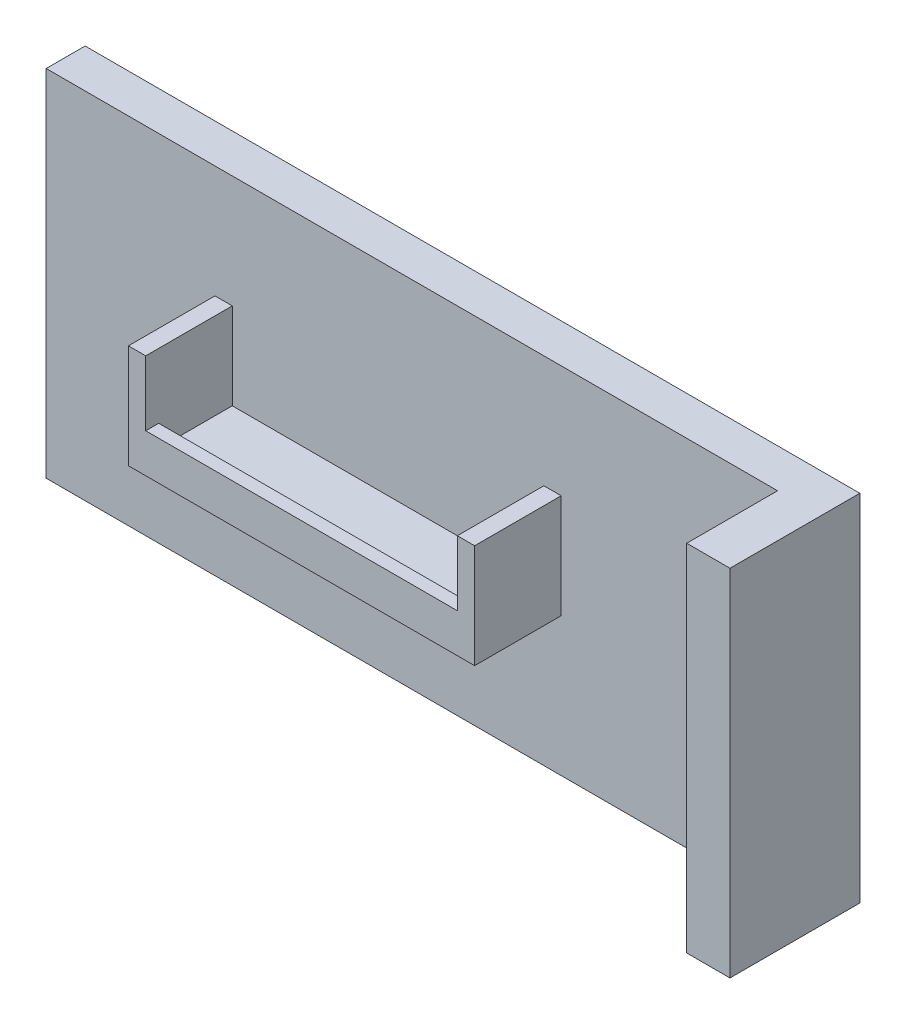
ISO-10303-21;
HEADER;
FILE_DESCRIPTION(('STEP AP214'),'2;1');
FILE_NAME('part.step','',(''),(''),'','','');
FILE_SCHEMA(('AUTOMOTIVE_DESIGN { 1 0 10303 214 1 1 1 1 }'));
ENDSEC;
DATA;
#1=APPLICATION_CONTEXT('core data for automotive mechanical design processes');
#2=APPLICATION_PROTOCOL_DEFINITION('international standard','automotive_design',2000,#1);
#3=PRODUCT_CONTEXT('',#1,'mechanical');
#4=PRODUCT('Part','Part','',(#3));
#5=PRODUCT_RELATED_PRODUCT_CATEGORY('part','',(#4));
#6=PRODUCT_DEFINITION_FORMATION('','',#4);
#7=PRODUCT_DEFINITION_CONTEXT('part definition',#1,'design');
#8=PRODUCT_DEFINITION('design','',#6,#7);
#9=PRODUCT_DEFINITION_SHAPE('','',#8);
#10=(LENGTH_UNIT() NAMED_UNIT(*) SI_UNIT(.MILLI.,.METRE.));
#11=(NAMED_UNIT(*) PLANE_ANGLE_UNIT() SI_UNIT($,.RADIAN.));
#12=(NAMED_UNIT(*) SI_UNIT($,.STERADIAN.) SOLID_ANGLE_UNIT());
#13=UNCERTAINTY_MEASURE_WITH_UNIT(LENGTH_MEASURE(1.E-05),#10,'distance_accuracy_value','');
#14=(GEOMETRIC_REPRESENTATION_CONTEXT(3) GLOBAL_UNCERTAINTY_ASSIGNED_CONTEXT((#13)) GLOBAL_UNIT_ASSIGNED_CONTEXT((#10,
#11,#12)) REPRESENTATION_CONTEXT('',''));
#15=CARTESIAN_POINT('',(0.,0.,0.));
#16=DIRECTION('',(0.,0.,1.));
#17=DIRECTION('',(1.,0.,0.));
#18=AXIS2_PLACEMENT_3D('',#15,#16,#17);
#19=CARTESIAN_POINT('',(-130.,36.,29.));
#20=DIRECTION('',(0.,-1.,0.));
#21=DIRECTION('',(1.,0.,0.));
#22=AXIS2_PLACEMENT_3D('',#19,#20,#21);
#23=PLANE('',#22);
#24=DIRECTION('',(-1.,0.,0.));
#25=VECTOR('',#24,1.);
#26=CARTESIAN_POINT('',(-126.,36.,26.));
#27=LINE('',#26,#25);
#28=CARTESIAN_POINT('',(-54.,36.,26.));
#29=VERTEX_POINT('',#28);
#30=CARTESIAN_POINT('',(-126.,36.,26.));
#31=VERTEX_POINT('',#30);
#32=EDGE_CURVE('E177',#29,#31,#27,.T.);
#33=ORIENTED_EDGE('',*,*,#32,.F.);
#34=DIRECTION('',(0.,0.,1.));
#35=VECTOR('',#34,1.);
#36=CARTESIAN_POINT('',(-54.,36.,9.));
#37=LINE('',#36,#35);
#38=CARTESIAN_POINT('',(-54.,36.,9.));
#39=VERTEX_POINT('',#38);
#40=EDGE_CURVE('E162',#39,#29,#37,.T.);
#41=ORIENTED_EDGE('',*,*,#40,.F.);
#42=DIRECTION('',(-1.,0.,0.));
#43=VECTOR('',#42,1.);
#44=CARTESIAN_POINT('',(-130.,36.,9.));
#45=LINE('',#44,#43);
#46=CARTESIAN_POINT('',(-126.,36.,9.));
#47=VERTEX_POINT('',#46);
#48=EDGE_CURVE('E218',#39,#47,#45,.T.);
#49=ORIENTED_EDGE('',*,*,#48,.T.);
#50=DIRECTION('',(0.,0.,-1.));
#51=VECTOR('',#50,1.);
#52=CARTESIAN_POINT('',(-126.,36.,9.));
#53=LINE('',#52,#51);
#54=EDGE_CURVE('E187',#31,#47,#53,.T.);
#55=ORIENTED_EDGE('',*,*,#54,.F.);
#56=EDGE_LOOP('',(#33,#41,#49,#55));
#57=FACE_BOUND('',#56,.T.);
#58=ADVANCED_FACE('F39',(#57),#23,.F.);
#59=CARTESIAN_POINT('',(-54.,56.,9.));
#60=DIRECTION('',(1.,0.,0.));
#61=DIRECTION('',(0.,1.,0.));
#62=AXIS2_PLACEMENT_3D('',#59,#60,#61);
#63=PLANE('',#62);
#64=DIRECTION('',(0.,-1.,0.));
#65=VECTOR('',#64,1.);
#66=CARTESIAN_POINT('',(-54.,41.,26.));
#67=LINE('',#66,#65);
#68=CARTESIAN_POINT('',(-54.,41.,26.));
#69=VERTEX_POINT('',#68);
#70=EDGE_CURVE('E54',#69,#29,#67,.T.);
#71=ORIENTED_EDGE('',*,*,#70,.F.);
#72=DIRECTION('',(0.,0.,-1.));
#73=VECTOR('',#72,1.);
#74=CARTESIAN_POINT('',(-54.,41.,29.));
#75=LINE('',#74,#73);
#76=CARTESIAN_POINT('',(-54.,41.,29.));
#77=VERTEX_POINT('',#76);
#78=EDGE_CURVE('E58',#77,#69,#75,.T.);
#79=ORIENTED_EDGE('',*,*,#78,.F.);
#80=DIRECTION('',(0.,-1.,0.));
#81=VECTOR('',#80,1.);
#82=CARTESIAN_POINT('',(-54.,56.,29.));
#83=LINE('',#82,#81);
#84=CARTESIAN_POINT('',(-54.,56.,29.));
#85=VERTEX_POINT('',#84);
#86=EDGE_CURVE('E170',#85,#77,#83,.T.);
#87=ORIENTED_EDGE('',*,*,#86,.F.);
#88=DIRECTION('',(0.,0.,1.));
#89=VECTOR('',#88,1.);
#90=CARTESIAN_POINT('',(-54.,56.,9.));
#91=LINE('',#90,#89);
#92=CARTESIAN_POINT('',(-54.,56.,9.));
#93=VERTEX_POINT('',#92);
#94=EDGE_CURVE('E205',#93,#85,#91,.T.);
#95=ORIENTED_EDGE('',*,*,#94,.F.);
#96=DIRECTION('',(0.,-1.,0.));
#97=VECTOR('',#96,1.);
#98=CARTESIAN_POINT('',(-54.,56.,9.));
#99=LINE('',#98,#97);
#100=EDGE_CURVE('E212',#93,#39,#99,.T.);
#101=ORIENTED_EDGE('',*,*,#100,.T.);
#102=ORIENTED_EDGE('',*,*,#40,.T.);
#103=EDGE_LOOP('',(#71,#79,#87,#95,#101,#102));
#104=FACE_BOUND('',#103,.T.);
#105=ADVANCED_FACE('F313',(#104),#63,.F.);
#106=CARTESIAN_POINT('',(-126.,56.,9.));
#107=DIRECTION('',(-1.,0.,0.));
#108=DIRECTION('',(0.,-1.,0.));
#109=AXIS2_PLACEMENT_3D('',#106,#107,#108);
#110=PLANE('',#109);
#111=DIRECTION('',(0.,-1.,0.));
#112=VECTOR('',#111,1.);
#113=CARTESIAN_POINT('',(-126.,41.,26.));
#114=LINE('',#113,#112);
#115=CARTESIAN_POINT('',(-126.,41.,26.));
#116=VERTEX_POINT('',#115);
#117=EDGE_CURVE('E183',#116,#31,#114,.T.);
#118=ORIENTED_EDGE('',*,*,#117,.T.);
#119=ORIENTED_EDGE('',*,*,#54,.T.);
#120=DIRECTION('',(0.,-1.,0.));
#121=VECTOR('',#120,1.);
#122=CARTESIAN_POINT('',(-126.,56.,9.));
#123=LINE('',#122,#121);
#124=CARTESIAN_POINT('',(-126.,56.,9.));
#125=VERTEX_POINT('',#124);
#126=EDGE_CURVE('E163',#125,#47,#123,.T.);
#127=ORIENTED_EDGE('',*,*,#126,.F.);
#128=DIRECTION('',(0.,0.,-1.));
#129=VECTOR('',#128,1.);
#130=CARTESIAN_POINT('',(-126.,56.,9.));
#131=LINE('',#130,#129);
#132=CARTESIAN_POINT('',(-126.,56.,29.));
#133=VERTEX_POINT('',#132);
#134=EDGE_CURVE('E159',#133,#125,#131,.T.);
#135=ORIENTED_EDGE('',*,*,#134,.F.);
#136=DIRECTION('',(0.,-1.,0.));
#137=VECTOR('',#136,1.);
#138=CARTESIAN_POINT('',(-126.,56.,29.));
#139=LINE('',#138,#137);
#140=CARTESIAN_POINT('',(-126.,41.,29.));
#141=VERTEX_POINT('',#140);
#142=EDGE_CURVE('E152',#133,#141,#139,.T.);
#143=ORIENTED_EDGE('',*,*,#142,.T.);
#144=DIRECTION('',(0.,0.,1.));
#145=VECTOR('',#144,1.);
#146=CARTESIAN_POINT('',(-126.,41.,29.));
#147=LINE('',#146,#145);
#148=EDGE_CURVE('E156',#116,#141,#147,.T.);
#149=ORIENTED_EDGE('',*,*,#148,.F.);
#150=EDGE_LOOP('',(#118,#119,#127,#135,#143,#149));
#151=FACE_BOUND('',#150,.T.);
#152=ADVANCED_FACE('F154',(#151),#110,.F.);
#153=CARTESIAN_POINT('',(0.,0.,9.));
#154=DIRECTION('',(0.,0.,1.));
#155=DIRECTION('',(1.,0.,0.));
#156=AXIS2_PLACEMENT_3D('',#153,#154,#155);
#157=PLANE('',#156);
#158=DIRECTION('',(0.,1.,0.));
#159=VECTOR('',#158,1.);
#160=CARTESIAN_POINT('',(0.,0.,9.));
#161=LINE('',#160,#159);
#162=CARTESIAN_POINT('',(0.,0.,9.));
#163=VERTEX_POINT('',#162);
#164=CARTESIAN_POINT('',(0.,82.,9.));
#165=VERTEX_POINT('',#164);
#166=EDGE_CURVE('E259',#163,#165,#161,.T.);
#167=ORIENTED_EDGE('',*,*,#166,.T.);
#168=DIRECTION('',(-1.,0.,0.));
#169=VECTOR('',#168,1.);
#170=CARTESIAN_POINT('',(0.,82.,9.));
#171=LINE('',#170,#169);
#172=CARTESIAN_POINT('',(-169.,82.,9.));
#173=VERTEX_POINT('',#172);
#174=EDGE_CURVE('E262',#165,#173,#171,.T.);
#175=ORIENTED_EDGE('',*,*,#174,.T.);
#176=DIRECTION('',(0.,-1.,0.));
#177=VECTOR('',#176,1.);
#178=CARTESIAN_POINT('',(-169.,0.,9.));
#179=LINE('',#178,#177);
#180=CARTESIAN_POINT('',(-169.,0.,9.));
#181=VERTEX_POINT('',#180);
#182=EDGE_CURVE('E265',#173,#181,#179,.T.);
#183=ORIENTED_EDGE('',*,*,#182,.T.);
#184=DIRECTION('',(1.,0.,0.));
#185=VECTOR('',#184,1.);
#186=CARTESIAN_POINT('',(0.,0.,9.));
#187=LINE('',#186,#185);
#188=EDGE_CURVE('E267',#181,#163,#187,.T.);
#189=ORIENTED_EDGE('',*,*,#188,.T.);
#190=EDGE_LOOP('',(#167,#175,#183,#189));
#191=FACE_BOUND('',#190,.T.);
#192=DIRECTION('',(0.,-1.,0.));
#193=VECTOR('',#192,1.);
#194=CARTESIAN_POINT('',(-130.,36.,9.));
#195=LINE('',#194,#193);
#196=CARTESIAN_POINT('',(-130.,56.,9.));
#197=VERTEX_POINT('',#196);
#198=CARTESIAN_POINT('',(-130.,32.,9.));
#199=VERTEX_POINT('',#198);
#200=EDGE_CURVE('E214',#197,#199,#195,.T.);
#201=ORIENTED_EDGE('',*,*,#200,.F.);
#202=DIRECTION('',(-1.,0.,0.));
#203=VECTOR('',#202,1.);
#204=CARTESIAN_POINT('',(-130.,56.,9.));
#205=LINE('',#204,#203);
#206=EDGE_CURVE('E194',#125,#197,#205,.T.);
#207=ORIENTED_EDGE('',*,*,#206,.F.);
#208=ORIENTED_EDGE('',*,*,#126,.T.);
#209=ORIENTED_EDGE('',*,*,#48,.F.);
#210=ORIENTED_EDGE('',*,*,#100,.F.);
#211=DIRECTION('',(-1.,0.,0.));
#212=VECTOR('',#211,1.);
#213=CARTESIAN_POINT('',(-50.,56.,9.));
#214=LINE('',#213,#212);
#215=CARTESIAN_POINT('',(-50.,56.,9.));
#216=VERTEX_POINT('',#215);
#217=EDGE_CURVE('E203',#216,#93,#214,.T.);
#218=ORIENTED_EDGE('',*,*,#217,.F.);
#219=DIRECTION('',(0.,1.,0.));
#220=VECTOR('',#219,1.);
#221=CARTESIAN_POINT('',(-50.,36.,9.));
#222=LINE('',#221,#220);
#223=CARTESIAN_POINT('',(-50.,32.,9.));
#224=VERTEX_POINT('',#223);
#225=EDGE_CURVE('E227',#224,#216,#222,.T.);
#226=ORIENTED_EDGE('',*,*,#225,.F.);
#227=DIRECTION('',(1.,0.,0.));
#228=VECTOR('',#227,1.);
#229=CARTESIAN_POINT('',(-130.,32.,9.));
#230=LINE('',#229,#228);
#231=EDGE_CURVE('E225',#199,#224,#230,.T.);
#232=ORIENTED_EDGE('',*,*,#231,.F.);
#233=EDGE_LOOP('',(#201,#207,#208,#209,#210,#218,#226,#232));
#234=FACE_BOUND('',#233,.T.);
#235=ADVANCED_FACE('F300',(#191,#234),#157,.T.);
#236=CARTESIAN_POINT('',(0.,82.,9.));
#237=DIRECTION('',(0.,-1.,0.));
#238=DIRECTION('',(0.,0.,-1.));
#239=AXIS2_PLACEMENT_3D('',#236,#237,#238);
#240=PLANE('',#239);
#241=DIRECTION('',(-1.,0.,0.));
#242=VECTOR('',#241,1.);
#243=CARTESIAN_POINT('',(0.,82.,0.));
#244=LINE('',#243,#242);
#245=CARTESIAN_POINT('',(10.,82.,0.));
#246=VERTEX_POINT('',#245);
#247=CARTESIAN_POINT('',(-169.,82.,0.));
#248=VERTEX_POINT('',#247);
#249=EDGE_CURVE('E254',#246,#248,#244,.T.);
#250=ORIENTED_EDGE('',*,*,#249,.T.);
#251=DIRECTION('',(0.,0.,-1.));
#252=VECTOR('',#251,1.);
#253=CARTESIAN_POINT('',(-169.,82.,9.));
#254=LINE('',#253,#252);
#255=EDGE_CURVE('E11',#173,#248,#254,.T.);
#256=ORIENTED_EDGE('',*,*,#255,.F.);
#257=ORIENTED_EDGE('',*,*,#174,.F.);
#258=DIRECTION('',(0.,0.,1.));
#259=VECTOR('',#258,1.);
#260=CARTESIAN_POINT('',(0.,82.,0.));
#261=LINE('',#260,#259);
#262=CARTESIAN_POINT('',(0.,82.,30.));
#263=VERTEX_POINT('',#262);
#264=EDGE_CURVE('E240',#165,#263,#261,.T.);
#265=ORIENTED_EDGE('',*,*,#264,.T.);
#266=DIRECTION('',(1.,0.,0.));
#267=VECTOR('',#266,1.);
#268=CARTESIAN_POINT('',(0.,82.,30.));
#269=LINE('',#268,#267);
#270=CARTESIAN_POINT('',(10.,82.,30.));
#271=VERTEX_POINT('',#270);
#272=EDGE_CURVE('E235',#263,#271,#269,.T.);
#273=ORIENTED_EDGE('',*,*,#272,.T.);
#274=DIRECTION('',(0.,0.,1.));
#275=VECTOR('',#274,1.);
#276=CARTESIAN_POINT('',(10.,82.,0.));
#277=LINE('',#276,#275);
#278=EDGE_CURVE('E247',#246,#271,#277,.T.);
#279=ORIENTED_EDGE('',*,*,#278,.F.);
#280=EDGE_LOOP('',(#250,#256,#257,#265,#273,#279));
#281=FACE_BOUND('',#280,.T.);
#282=ADVANCED_FACE('F41',(#281),#240,.F.);
#283=CARTESIAN_POINT('',(-169.,0.,9.));
#284=DIRECTION('',(1.,0.,0.));
#285=DIRECTION('',(0.,0.,-1.));
#286=AXIS2_PLACEMENT_3D('',#283,#284,#285);
#287=PLANE('',#286);
#288=DIRECTION('',(0.,-1.,0.));
#289=VECTOR('',#288,1.);
#290=CARTESIAN_POINT('',(-169.,0.,0.));
#291=LINE('',#290,#289);
#292=CARTESIAN_POINT('',(-169.,0.,0.));
#293=VERTEX_POINT('',#292);
#294=EDGE_CURVE('E271',#248,#293,#291,.T.);
#295=ORIENTED_EDGE('',*,*,#294,.T.);
#296=DIRECTION('',(0.,0.,-1.));
#297=VECTOR('',#296,1.);
#298=CARTESIAN_POINT('',(-169.,0.,9.));
#299=LINE('',#298,#297);
#300=EDGE_CURVE('E47',#181,#293,#299,.T.);
#301=ORIENTED_EDGE('',*,*,#300,.F.);
#302=ORIENTED_EDGE('',*,*,#182,.F.);
#303=ORIENTED_EDGE('',*,*,#255,.T.);
#304=EDGE_LOOP('',(#295,#301,#302,#303));
#305=FACE_BOUND('',#304,.T.);
#306=ADVANCED_FACE('F303',(#305),#287,.F.);
#307=CARTESIAN_POINT('',(0.,0.,9.));
#308=DIRECTION('',(0.,1.,0.));
#309=DIRECTION('',(0.,0.,1.));
#310=AXIS2_PLACEMENT_3D('',#307,#308,#309);
#311=PLANE('',#310);
#312=DIRECTION('',(1.,0.,0.));
#313=VECTOR('',#312,1.);
#314=CARTESIAN_POINT('',(0.,0.,0.));
#315=LINE('',#314,#313);
#316=CARTESIAN_POINT('',(10.,0.,0.));
#317=VERTEX_POINT('',#316);
#318=EDGE_CURVE('E263',#293,#317,#315,.T.);
#319=ORIENTED_EDGE('',*,*,#318,.T.);
#320=DIRECTION('',(0.,0.,1.));
#321=VECTOR('',#320,1.);
#322=CARTESIAN_POINT('',(10.,0.,0.));
#323=LINE('',#322,#321);
#324=CARTESIAN_POINT('',(10.,0.,30.));
#325=VERTEX_POINT('',#324);
#326=EDGE_CURVE('E239',#317,#325,#323,.T.);
#327=ORIENTED_EDGE('',*,*,#326,.T.);
#328=DIRECTION('',(1.,0.,0.));
#329=VECTOR('',#328,1.);
#330=CARTESIAN_POINT('',(0.,0.,30.));
#331=LINE('',#330,#329);
#332=CARTESIAN_POINT('',(0.,0.,30.));
#333=VERTEX_POINT('',#332);
#334=EDGE_CURVE('E236',#333,#325,#331,.T.);
#335=ORIENTED_EDGE('',*,*,#334,.F.);
#336=DIRECTION('',(0.,0.,1.));
#337=VECTOR('',#336,1.);
#338=CARTESIAN_POINT('',(0.,0.,0.));
#339=LINE('',#338,#337);
#340=EDGE_CURVE('E242',#163,#333,#339,.T.);
#341=ORIENTED_EDGE('',*,*,#340,.F.);
#342=ORIENTED_EDGE('',*,*,#188,.F.);
#343=ORIENTED_EDGE('',*,*,#300,.T.);
#344=EDGE_LOOP('',(#319,#327,#335,#341,#342,#343));
#345=FACE_BOUND('',#344,.T.);
#346=ADVANCED_FACE('F278',(#345),#311,.F.);
#347=CARTESIAN_POINT('',(0.,0.,0.));
#348=DIRECTION('',(0.,0.,1.));
#349=DIRECTION('',(1.,0.,0.));
#350=AXIS2_PLACEMENT_3D('',#347,#348,#349);
#351=PLANE('',#350);
#352=ORIENTED_EDGE('',*,*,#249,.F.);
#353=DIRECTION('',(0.,1.,0.));
#354=VECTOR('',#353,1.);
#355=CARTESIAN_POINT('',(10.,0.,0.));
#356=LINE('',#355,#354);
#357=EDGE_CURVE('E255',#317,#246,#356,.T.);
#358=ORIENTED_EDGE('',*,*,#357,.F.);
#359=ORIENTED_EDGE('',*,*,#318,.F.);
#360=ORIENTED_EDGE('',*,*,#294,.F.);
#361=EDGE_LOOP('',(#352,#358,#359,#360));
#362=FACE_BOUND('',#361,.T.);
#363=ADVANCED_FACE('F285',(#362),#351,.F.);
#364=CARTESIAN_POINT('',(0.,0.,0.));
#365=DIRECTION('',(-1.,0.,0.));
#366=DIRECTION('',(0.,0.,1.));
#367=AXIS2_PLACEMENT_3D('',#364,#365,#366);
#368=PLANE('',#367);
#369=ORIENTED_EDGE('',*,*,#166,.F.);
#370=ORIENTED_EDGE('',*,*,#340,.T.);
#371=DIRECTION('',(0.,1.,0.));
#372=VECTOR('',#371,1.);
#373=CARTESIAN_POINT('',(0.,0.,30.));
#374=LINE('',#373,#372);
#375=EDGE_CURVE('E251',#333,#263,#374,.T.);
#376=ORIENTED_EDGE('',*,*,#375,.T.);
#377=ORIENTED_EDGE('',*,*,#264,.F.);
#378=EDGE_LOOP('',(#369,#370,#376,#377));
#379=FACE_BOUND('',#378,.T.);
#380=ADVANCED_FACE('F297',(#379),#368,.T.);
#381=CARTESIAN_POINT('',(0.,0.,30.));
#382=DIRECTION('',(0.,0.,1.));
#383=DIRECTION('',(1.,0.,0.));
#384=AXIS2_PLACEMENT_3D('',#381,#382,#383);
#385=PLANE('',#384);
#386=ORIENTED_EDGE('',*,*,#272,.F.);
#387=ORIENTED_EDGE('',*,*,#375,.F.);
#388=ORIENTED_EDGE('',*,*,#334,.T.);
#389=DIRECTION('',(0.,1.,0.));
#390=VECTOR('',#389,1.);
#391=CARTESIAN_POINT('',(10.,0.,30.));
#392=LINE('',#391,#390);
#393=EDGE_CURVE('E244',#325,#271,#392,.T.);
#394=ORIENTED_EDGE('',*,*,#393,.T.);
#395=EDGE_LOOP('',(#386,#387,#388,#394));
#396=FACE_BOUND('',#395,.T.);
#397=ADVANCED_FACE('F295',(#396),#385,.T.);
#398=CARTESIAN_POINT('',(10.,0.,0.));
#399=DIRECTION('',(-1.,0.,0.));
#400=DIRECTION('',(0.,0.,1.));
#401=AXIS2_PLACEMENT_3D('',#398,#399,#400);
#402=PLANE('',#401);
#403=ORIENTED_EDGE('',*,*,#278,.T.);
#404=ORIENTED_EDGE('',*,*,#393,.F.);
#405=ORIENTED_EDGE('',*,*,#326,.F.);
#406=ORIENTED_EDGE('',*,*,#357,.T.);
#407=EDGE_LOOP('',(#403,#404,#405,#406));
#408=FACE_BOUND('',#407,.T.);
#409=ADVANCED_FACE('F290',(#408),#402,.F.);
#410=CARTESIAN_POINT('',(-130.,36.,29.));
#411=DIRECTION('',(1.,0.,0.));
#412=DIRECTION('',(0.,0.,-1.));
#413=AXIS2_PLACEMENT_3D('',#410,#411,#412);
#414=PLANE('',#413);
#415=ORIENTED_EDGE('',*,*,#200,.T.);
#416=DIRECTION('',(0.,0.,-1.));
#417=VECTOR('',#416,1.);
#418=CARTESIAN_POINT('',(-130.,32.,29.));
#419=LINE('',#418,#417);
#420=CARTESIAN_POINT('',(-130.,32.,29.));
#421=VERTEX_POINT('',#420);
#422=EDGE_CURVE('E233',#421,#199,#419,.T.);
#423=ORIENTED_EDGE('',*,*,#422,.F.);
#424=DIRECTION('',(0.,-1.,0.));
#425=VECTOR('',#424,1.);
#426=CARTESIAN_POINT('',(-130.,36.,29.));
#427=LINE('',#426,#425);
#428=CARTESIAN_POINT('',(-130.,56.,29.));
#429=VERTEX_POINT('',#428);
#430=EDGE_CURVE('E215',#429,#421,#427,.T.);
#431=ORIENTED_EDGE('',*,*,#430,.F.);
#432=DIRECTION('',(0.,0.,1.));
#433=VECTOR('',#432,1.);
#434=CARTESIAN_POINT('',(-130.,56.,9.));
#435=LINE('',#434,#433);
#436=EDGE_CURVE('E188',#197,#429,#435,.T.);
#437=ORIENTED_EDGE('',*,*,#436,.F.);
#438=EDGE_LOOP('',(#415,#423,#431,#437));
#439=FACE_BOUND('',#438,.T.);
#440=ADVANCED_FACE('F330',(#439),#414,.F.);
#441=CARTESIAN_POINT('',(-130.,32.,29.));
#442=DIRECTION('',(0.,1.,0.));
#443=DIRECTION('',(-1.,0.,0.));
#444=AXIS2_PLACEMENT_3D('',#441,#442,#443);
#445=PLANE('',#444);
#446=ORIENTED_EDGE('',*,*,#231,.T.);
#447=DIRECTION('',(0.,0.,-1.));
#448=VECTOR('',#447,1.);
#449=CARTESIAN_POINT('',(-50.,32.,29.));
#450=LINE('',#449,#448);
#451=CARTESIAN_POINT('',(-50.,32.,29.));
#452=VERTEX_POINT('',#451);
#453=EDGE_CURVE('E222',#452,#224,#450,.T.);
#454=ORIENTED_EDGE('',*,*,#453,.F.);
#455=DIRECTION('',(1.,0.,0.));
#456=VECTOR('',#455,1.);
#457=CARTESIAN_POINT('',(-130.,32.,29.));
#458=LINE('',#457,#456);
#459=EDGE_CURVE('E217',#421,#452,#458,.T.);
#460=ORIENTED_EDGE('',*,*,#459,.F.);
#461=ORIENTED_EDGE('',*,*,#422,.T.);
#462=EDGE_LOOP('',(#446,#454,#460,#461));
#463=FACE_BOUND('',#462,.T.);
#464=ADVANCED_FACE('F326',(#463),#445,.F.);
#465=CARTESIAN_POINT('',(-50.,36.,29.));
#466=DIRECTION('',(-1.,0.,0.));
#467=DIRECTION('',(0.,0.,1.));
#468=AXIS2_PLACEMENT_3D('',#465,#466,#467);
#469=PLANE('',#468);
#470=ORIENTED_EDGE('',*,*,#225,.T.);
#471=DIRECTION('',(0.,0.,-1.));
#472=VECTOR('',#471,1.);
#473=CARTESIAN_POINT('',(-50.,56.,9.));
#474=LINE('',#473,#472);
#475=CARTESIAN_POINT('',(-50.,56.,29.));
#476=VERTEX_POINT('',#475);
#477=EDGE_CURVE('E200',#476,#216,#474,.T.);
#478=ORIENTED_EDGE('',*,*,#477,.F.);
#479=DIRECTION('',(0.,1.,0.));
#480=VECTOR('',#479,1.);
#481=CARTESIAN_POINT('',(-50.,36.,29.));
#482=LINE('',#481,#480);
#483=EDGE_CURVE('E220',#452,#476,#482,.T.);
#484=ORIENTED_EDGE('',*,*,#483,.F.);
#485=ORIENTED_EDGE('',*,*,#453,.T.);
#486=EDGE_LOOP('',(#470,#478,#484,#485));
#487=FACE_BOUND('',#486,.T.);
#488=ADVANCED_FACE('F323',(#487),#469,.F.);
#489=CARTESIAN_POINT('',(0.,0.,29.));
#490=DIRECTION('',(0.,0.,1.));
#491=DIRECTION('',(1.,0.,0.));
#492=AXIS2_PLACEMENT_3D('',#489,#490,#491);
#493=PLANE('',#492);
#494=ORIENTED_EDGE('',*,*,#430,.T.);
#495=ORIENTED_EDGE('',*,*,#459,.T.);
#496=ORIENTED_EDGE('',*,*,#483,.T.);
#497=DIRECTION('',(1.,0.,0.));
#498=VECTOR('',#497,1.);
#499=CARTESIAN_POINT('',(-50.,56.,29.));
#500=LINE('',#499,#498);
#501=EDGE_CURVE('E207',#85,#476,#500,.T.);
#502=ORIENTED_EDGE('',*,*,#501,.F.);
#503=ORIENTED_EDGE('',*,*,#86,.T.);
#504=DIRECTION('',(1.,0.,0.));
#505=VECTOR('',#504,1.);
#506=CARTESIAN_POINT('',(-126.,41.,29.));
#507=LINE('',#506,#505);
#508=EDGE_CURVE('E166',#141,#77,#507,.T.);
#509=ORIENTED_EDGE('',*,*,#508,.F.);
#510=ORIENTED_EDGE('',*,*,#142,.F.);
#511=DIRECTION('',(1.,0.,0.));
#512=VECTOR('',#511,1.);
#513=CARTESIAN_POINT('',(-130.,56.,29.));
#514=LINE('',#513,#512);
#515=EDGE_CURVE('E191',#429,#133,#514,.T.);
#516=ORIENTED_EDGE('',*,*,#515,.F.);
#517=EDGE_LOOP('',(#494,#495,#496,#502,#503,#509,#510,#516));
#518=FACE_BOUND('',#517,.T.);
#519=ADVANCED_FACE('F168',(#518),#493,.T.);
#520=CARTESIAN_POINT('',(0.,56.,0.));
#521=DIRECTION('',(0.,-1.,0.));
#522=DIRECTION('',(0.,0.,-1.));
#523=AXIS2_PLACEMENT_3D('',#520,#521,#522);
#524=PLANE('',#523);
#525=ORIENTED_EDGE('',*,*,#477,.T.);
#526=ORIENTED_EDGE('',*,*,#217,.T.);
#527=ORIENTED_EDGE('',*,*,#94,.T.);
#528=ORIENTED_EDGE('',*,*,#501,.T.);
#529=EDGE_LOOP('',(#525,#526,#527,#528));
#530=FACE_BOUND('',#529,.T.);
#531=ADVANCED_FACE('F382',(#530),#524,.F.);
#532=CARTESIAN_POINT('',(0.,56.,0.));
#533=DIRECTION('',(0.,1.,0.));
#534=DIRECTION('',(0.,0.,1.));
#535=AXIS2_PLACEMENT_3D('',#532,#533,#534);
#536=PLANE('',#535);
#537=ORIENTED_EDGE('',*,*,#436,.T.);
#538=ORIENTED_EDGE('',*,*,#515,.T.);
#539=ORIENTED_EDGE('',*,*,#134,.T.);
#540=ORIENTED_EDGE('',*,*,#206,.T.);
#541=EDGE_LOOP('',(#537,#538,#539,#540));
#542=FACE_BOUND('',#541,.T.);
#543=ADVANCED_FACE('F385',(#542),#536,.T.);
#544=CARTESIAN_POINT('',(-126.,41.,26.));
#545=DIRECTION('',(0.,0.,1.));
#546=DIRECTION('',(1.,0.,0.));
#547=AXIS2_PLACEMENT_3D('',#544,#545,#546);
#548=PLANE('',#547);
#549=ORIENTED_EDGE('',*,*,#32,.T.);
#550=ORIENTED_EDGE('',*,*,#117,.F.);
#551=DIRECTION('',(-1.,0.,0.));
#552=VECTOR('',#551,1.);
#553=CARTESIAN_POINT('',(-126.,41.,26.));
#554=LINE('',#553,#552);
#555=EDGE_CURVE('E175',#69,#116,#554,.T.);
#556=ORIENTED_EDGE('',*,*,#555,.F.);
#557=ORIENTED_EDGE('',*,*,#70,.T.);
#558=EDGE_LOOP('',(#549,#550,#556,#557));
#559=FACE_BOUND('',#558,.T.);
#560=ADVANCED_FACE('F403',(#559),#548,.F.);
#561=CARTESIAN_POINT('',(0.,41.,0.));
#562=DIRECTION('',(0.,-1.,0.));
#563=DIRECTION('',(1.,0.,0.));
#564=AXIS2_PLACEMENT_3D('',#561,#562,#563);
#565=PLANE('',#564);
#566=ORIENTED_EDGE('',*,*,#148,.T.);
#567=ORIENTED_EDGE('',*,*,#508,.T.);
#568=ORIENTED_EDGE('',*,*,#78,.T.);
#569=ORIENTED_EDGE('',*,*,#555,.T.);
#570=EDGE_LOOP('',(#566,#567,#568,#569));
#571=FACE_BOUND('',#570,.T.);
#572=ADVANCED_FACE('F173',(#571),#565,.F.);
#573=CLOSED_SHELL('',(#58,#105,#152,#235,#282,#306,#346,#363,#380,#397,#409,#440,#464,#488,#519,
#531,#543,#560,#572));
#574=MANIFOLD_SOLID_BREP('B2',#573);
#575=ADVANCED_BREP_SHAPE_REPRESENTATION('',(#18,#574),#14);
#576=SHAPE_DEFINITION_REPRESENTATION(#9,#575);
ENDSEC;
END-ISO-10303-21;
